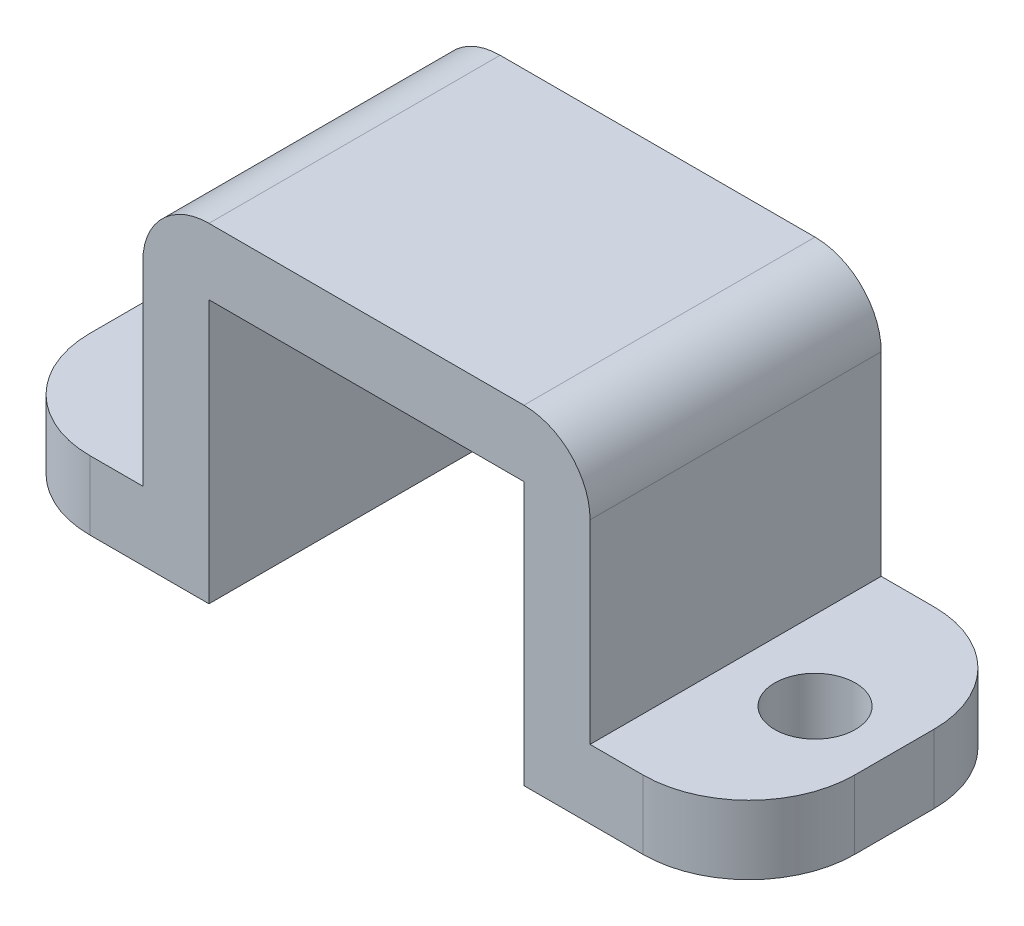
ISO-10303-21;
HEADER;
FILE_DESCRIPTION(('STEP AP214'),'2;1');
FILE_NAME('part.step','',(''),(''),'','','');
FILE_SCHEMA(('AUTOMOTIVE_DESIGN { 1 0 10303 214 1 1 1 1 }'));
ENDSEC;
DATA;
#1=APPLICATION_CONTEXT('core data for automotive mechanical design processes');
#2=APPLICATION_PROTOCOL_DEFINITION('international standard','automotive_design',2000,#1);
#3=PRODUCT_CONTEXT('',#1,'mechanical');
#4=PRODUCT('Part','Part','',(#3));
#5=PRODUCT_RELATED_PRODUCT_CATEGORY('part','',(#4));
#6=PRODUCT_DEFINITION_FORMATION('','',#4);
#7=PRODUCT_DEFINITION_CONTEXT('part definition',#1,'design');
#8=PRODUCT_DEFINITION('design','',#6,#7);
#9=PRODUCT_DEFINITION_SHAPE('','',#8);
#10=(LENGTH_UNIT() NAMED_UNIT(*) SI_UNIT(.MILLI.,.METRE.));
#11=(NAMED_UNIT(*) PLANE_ANGLE_UNIT() SI_UNIT($,.RADIAN.));
#12=(NAMED_UNIT(*) SI_UNIT($,.STERADIAN.) SOLID_ANGLE_UNIT());
#13=UNCERTAINTY_MEASURE_WITH_UNIT(LENGTH_MEASURE(1.E-05),#10,'distance_accuracy_value','');
#14=(GEOMETRIC_REPRESENTATION_CONTEXT(3) GLOBAL_UNCERTAINTY_ASSIGNED_CONTEXT((#13)) GLOBAL_UNIT_ASSIGNED_CONTEXT((#10,
#11,#12)) REPRESENTATION_CONTEXT('',''));
#15=CARTESIAN_POINT('',(0.,0.,0.));
#16=DIRECTION('',(0.,0.,1.));
#17=DIRECTION('',(1.,0.,0.));
#18=AXIS2_PLACEMENT_3D('',#15,#16,#17);
#19=CARTESIAN_POINT('',(-5.95,0.,11.));
#20=DIRECTION('',(-1.,0.,0.));
#21=DIRECTION('',(0.,0.,1.));
#22=AXIS2_PLACEMENT_3D('',#19,#20,#21);
#23=PLANE('',#22);
#24=DIRECTION('',(0.,1.,0.));
#25=VECTOR('',#24,1.);
#26=CARTESIAN_POINT('',(-5.95,0.,0.));
#27=LINE('',#26,#25);
#28=CARTESIAN_POINT('',(-5.95,0.,0.));
#29=VERTEX_POINT('',#28);
#30=CARTESIAN_POINT('',(-5.95,9.95,0.));
#31=VERTEX_POINT('',#30);
#32=EDGE_CURVE('E310',#29,#31,#27,.T.);
#33=ORIENTED_EDGE('',*,*,#32,.T.);
#34=DIRECTION('',(0.,0.,-1.));
#35=VECTOR('',#34,1.);
#36=CARTESIAN_POINT('',(-5.95,9.95,11.));
#37=LINE('',#36,#35);
#38=CARTESIAN_POINT('',(-5.95,9.95,11.));
#39=VERTEX_POINT('',#38);
#40=EDGE_CURVE('E182',#39,#31,#37,.T.);
#41=ORIENTED_EDGE('',*,*,#40,.F.);
#42=DIRECTION('',(0.,1.,0.));
#43=VECTOR('',#42,1.);
#44=CARTESIAN_POINT('',(-5.95,0.,11.));
#45=LINE('',#44,#43);
#46=CARTESIAN_POINT('',(-5.95,0.,11.));
#47=VERTEX_POINT('',#46);
#48=EDGE_CURVE('E169',#47,#39,#45,.T.);
#49=ORIENTED_EDGE('',*,*,#48,.F.);
#50=DIRECTION('',(0.,0.,-1.));
#51=VECTOR('',#50,1.);
#52=CARTESIAN_POINT('',(-5.95,0.,11.));
#53=LINE('',#52,#51);
#54=EDGE_CURVE('E180',#47,#29,#53,.T.);
#55=ORIENTED_EDGE('',*,*,#54,.T.);
#56=EDGE_LOOP('',(#33,#41,#49,#55));
#57=FACE_BOUND('',#56,.T.);
#58=ADVANCED_FACE('F38',(#57),#23,.F.);
#59=CARTESIAN_POINT('',(-5.95,9.95,11.));
#60=DIRECTION('',(0.,1.,0.));
#61=DIRECTION('',(0.,0.,1.));
#62=AXIS2_PLACEMENT_3D('',#59,#60,#61);
#63=PLANE('',#62);
#64=DIRECTION('',(1.,0.,0.));
#65=VECTOR('',#64,1.);
#66=CARTESIAN_POINT('',(-5.95,9.95,0.));
#67=LINE('',#66,#65);
#68=CARTESIAN_POINT('',(5.95,9.95,0.));
#69=VERTEX_POINT('',#68);
#70=EDGE_CURVE('E307',#31,#69,#67,.T.);
#71=ORIENTED_EDGE('',*,*,#70,.T.);
#72=DIRECTION('',(0.,0.,-1.));
#73=VECTOR('',#72,1.);
#74=CARTESIAN_POINT('',(5.95,9.95,11.));
#75=LINE('',#74,#73);
#76=CARTESIAN_POINT('',(5.95,9.95,11.));
#77=VERTEX_POINT('',#76);
#78=EDGE_CURVE('E194',#77,#69,#75,.T.);
#79=ORIENTED_EDGE('',*,*,#78,.F.);
#80=DIRECTION('',(1.,0.,0.));
#81=VECTOR('',#80,1.);
#82=CARTESIAN_POINT('',(-5.95,9.95,11.));
#83=LINE('',#82,#81);
#84=EDGE_CURVE('E184',#39,#77,#83,.T.);
#85=ORIENTED_EDGE('',*,*,#84,.F.);
#86=ORIENTED_EDGE('',*,*,#40,.T.);
#87=EDGE_LOOP('',(#71,#79,#85,#86));
#88=FACE_BOUND('',#87,.T.);
#89=ADVANCED_FACE('F350',(#88),#63,.F.);
#90=CARTESIAN_POINT('',(5.95,0.,11.));
#91=DIRECTION('',(1.,0.,0.));
#92=DIRECTION('',(0.,0.,-1.));
#93=AXIS2_PLACEMENT_3D('',#90,#91,#92);
#94=PLANE('',#93);
#95=DIRECTION('',(0.,-1.,0.));
#96=VECTOR('',#95,1.);
#97=CARTESIAN_POINT('',(5.95,0.,0.));
#98=LINE('',#97,#96);
#99=CARTESIAN_POINT('',(5.95,0.,0.));
#100=VERTEX_POINT('',#99);
#101=EDGE_CURVE('E303',#69,#100,#98,.T.);
#102=ORIENTED_EDGE('',*,*,#101,.T.);
#103=DIRECTION('',(0.,0.,-1.));
#104=VECTOR('',#103,1.);
#105=CARTESIAN_POINT('',(5.95,0.,11.));
#106=LINE('',#105,#104);
#107=CARTESIAN_POINT('',(5.95,0.,11.));
#108=VERTEX_POINT('',#107);
#109=EDGE_CURVE('E293',#108,#100,#106,.T.);
#110=ORIENTED_EDGE('',*,*,#109,.F.);
#111=DIRECTION('',(0.,-1.,0.));
#112=VECTOR('',#111,1.);
#113=CARTESIAN_POINT('',(5.95,0.,11.));
#114=LINE('',#113,#112);
#115=EDGE_CURVE('E304',#77,#108,#114,.T.);
#116=ORIENTED_EDGE('',*,*,#115,.F.);
#117=ORIENTED_EDGE('',*,*,#78,.T.);
#118=EDGE_LOOP('',(#102,#110,#116,#117));
#119=FACE_BOUND('',#118,.T.);
#120=ADVANCED_FACE('F301',(#119),#94,.F.);
#121=CARTESIAN_POINT('',(8.65875,0.,11.));
#122=DIRECTION('',(0.,1.,0.));
#123=DIRECTION('',(-1.,0.,0.));
#124=AXIS2_PLACEMENT_3D('',#121,#122,#123);
#125=PLANE('',#124);
#126=CARTESIAN_POINT('',(11.45,0.,5.5));
#127=DIRECTION('',(0.,1.,0.));
#128=DIRECTION('',(-1.,0.,0.));
#129=AXIS2_PLACEMENT_3D('',#126,#127,#128);
#130=CIRCLE('',#129,1.525);
#131=CARTESIAN_POINT('',(9.925,0.,5.5));
#132=VERTEX_POINT('',#131);
#133=EDGE_CURVE('E314',#132,#132,#130,.T.);
#134=ORIENTED_EDGE('',*,*,#133,.T.);
#135=EDGE_LOOP('',(#134));
#136=FACE_BOUND('',#135,.T.);
#137=DIRECTION('',(1.,0.,0.));
#138=VECTOR('',#137,1.);
#139=CARTESIAN_POINT('',(8.65875,0.,0.));
#140=LINE('',#139,#138);
#141=CARTESIAN_POINT('',(10.45,0.,0.));
#142=VERTEX_POINT('',#141);
#143=EDGE_CURVE('E268',#100,#142,#140,.T.);
#144=ORIENTED_EDGE('',*,*,#143,.T.);
#145=CARTESIAN_POINT('',(10.45,0.,4.));
#146=DIRECTION('',(0.,1.,0.));
#147=DIRECTION('',(-1.,0.,0.));
#148=AXIS2_PLACEMENT_3D('',#145,#146,#147);
#149=CIRCLE('',#148,4.);
#150=CARTESIAN_POINT('',(14.45,0.,4.));
#151=VERTEX_POINT('',#150);
#152=EDGE_CURVE('E210',#142,#151,#149,.F.);
#153=ORIENTED_EDGE('',*,*,#152,.T.);
#154=DIRECTION('',(0.,0.,-1.));
#155=VECTOR('',#154,1.);
#156=CARTESIAN_POINT('',(14.45,0.,11.));
#157=LINE('',#156,#155);
#158=CARTESIAN_POINT('',(14.45,0.,7.));
#159=VERTEX_POINT('',#158);
#160=EDGE_CURVE('E290',#159,#151,#157,.T.);
#161=ORIENTED_EDGE('',*,*,#160,.F.);
#162=CARTESIAN_POINT('',(10.45,0.,7.));
#163=DIRECTION('',(0.,1.,0.));
#164=DIRECTION('',(-1.,0.,0.));
#165=AXIS2_PLACEMENT_3D('',#162,#163,#164);
#166=CIRCLE('',#165,4.);
#167=CARTESIAN_POINT('',(10.45,0.,11.));
#168=VERTEX_POINT('',#167);
#169=EDGE_CURVE('E208',#159,#168,#166,.F.);
#170=ORIENTED_EDGE('',*,*,#169,.T.);
#171=DIRECTION('',(1.,0.,0.));
#172=VECTOR('',#171,1.);
#173=CARTESIAN_POINT('',(8.65875,0.,11.));
#174=LINE('',#173,#172);
#175=EDGE_CURVE('E320',#108,#168,#174,.T.);
#176=ORIENTED_EDGE('',*,*,#175,.F.);
#177=ORIENTED_EDGE('',*,*,#109,.T.);
#178=EDGE_LOOP('',(#144,#153,#161,#170,#176,#177));
#179=FACE_BOUND('',#178,.T.);
#180=ADVANCED_FACE('F390',(#136,#179),#125,.F.);
#181=CARTESIAN_POINT('',(14.45,0.,11.));
#182=DIRECTION('',(-1.,0.,0.));
#183=DIRECTION('',(0.,0.,1.));
#184=AXIS2_PLACEMENT_3D('',#181,#182,#183);
#185=PLANE('',#184);
#186=ORIENTED_EDGE('',*,*,#160,.T.);
#187=DIRECTION('',(0.,1.,0.));
#188=VECTOR('',#187,1.);
#189=CARTESIAN_POINT('',(14.45,0.,4.));
#190=LINE('',#189,#188);
#191=CARTESIAN_POINT('',(14.45,2.6,4.));
#192=VERTEX_POINT('',#191);
#193=EDGE_CURVE('E192',#151,#192,#190,.T.);
#194=ORIENTED_EDGE('',*,*,#193,.T.);
#195=DIRECTION('',(0.,0.,-1.));
#196=VECTOR('',#195,1.);
#197=CARTESIAN_POINT('',(14.45,2.6,11.));
#198=LINE('',#197,#196);
#199=CARTESIAN_POINT('',(14.45,2.6,7.));
#200=VERTEX_POINT('',#199);
#201=EDGE_CURVE('E287',#200,#192,#198,.T.);
#202=ORIENTED_EDGE('',*,*,#201,.F.);
#203=DIRECTION('',(0.,1.,0.));
#204=VECTOR('',#203,1.);
#205=CARTESIAN_POINT('',(14.45,0.,7.));
#206=LINE('',#205,#204);
#207=EDGE_CURVE('E190',#200,#159,#206,.F.);
#208=ORIENTED_EDGE('',*,*,#207,.T.);
#209=EDGE_LOOP('',(#186,#194,#202,#208));
#210=FACE_BOUND('',#209,.T.);
#211=ADVANCED_FACE('F395',(#210),#185,.F.);
#212=CARTESIAN_POINT('',(8.45,2.6,11.));
#213=DIRECTION('',(0.,-1.,0.));
#214=DIRECTION('',(1.,0.,0.));
#215=AXIS2_PLACEMENT_3D('',#212,#213,#214);
#216=PLANE('',#215);
#217=CARTESIAN_POINT('',(11.45,2.6,5.5));
#218=DIRECTION('',(0.,1.,0.));
#219=DIRECTION('',(-1.,0.,0.));
#220=AXIS2_PLACEMENT_3D('',#217,#218,#219);
#221=CIRCLE('',#220,1.525);
#222=CARTESIAN_POINT('',(9.925,2.6,5.5));
#223=VERTEX_POINT('',#222);
#224=EDGE_CURVE('E327',#223,#223,#221,.T.);
#225=ORIENTED_EDGE('',*,*,#224,.F.);
#226=EDGE_LOOP('',(#225));
#227=FACE_BOUND('',#226,.T.);
#228=ORIENTED_EDGE('',*,*,#201,.T.);
#229=CARTESIAN_POINT('',(10.45,2.6,4.));
#230=DIRECTION('',(0.,-1.,0.));
#231=DIRECTION('',(1.,0.,0.));
#232=AXIS2_PLACEMENT_3D('',#229,#230,#231);
#233=CIRCLE('',#232,4.);
#234=CARTESIAN_POINT('',(10.45,2.6,0.));
#235=VERTEX_POINT('',#234);
#236=EDGE_CURVE('E202',#192,#235,#233,.F.);
#237=ORIENTED_EDGE('',*,*,#236,.T.);
#238=DIRECTION('',(-1.,0.,0.));
#239=VECTOR('',#238,1.);
#240=CARTESIAN_POINT('',(8.45,2.6,0.));
#241=LINE('',#240,#239);
#242=CARTESIAN_POINT('',(8.45,2.6,0.));
#243=VERTEX_POINT('',#242);
#244=EDGE_CURVE('E264',#235,#243,#241,.T.);
#245=ORIENTED_EDGE('',*,*,#244,.T.);
#246=DIRECTION('',(0.,0.,-1.));
#247=VECTOR('',#246,1.);
#248=CARTESIAN_POINT('',(8.45,2.6,11.));
#249=LINE('',#248,#247);
#250=CARTESIAN_POINT('',(8.45,2.6,11.));
#251=VERTEX_POINT('',#250);
#252=EDGE_CURVE('E263',#251,#243,#249,.T.);
#253=ORIENTED_EDGE('',*,*,#252,.F.);
#254=DIRECTION('',(-1.,0.,0.));
#255=VECTOR('',#254,1.);
#256=CARTESIAN_POINT('',(8.45,2.6,11.));
#257=LINE('',#256,#255);
#258=CARTESIAN_POINT('',(10.45,2.6,11.));
#259=VERTEX_POINT('',#258);
#260=EDGE_CURVE('E318',#259,#251,#257,.T.);
#261=ORIENTED_EDGE('',*,*,#260,.F.);
#262=CARTESIAN_POINT('',(10.45,2.6,7.));
#263=DIRECTION('',(0.,-1.,0.));
#264=DIRECTION('',(1.,0.,0.));
#265=AXIS2_PLACEMENT_3D('',#262,#263,#264);
#266=CIRCLE('',#265,4.);
#267=EDGE_CURVE('E200',#259,#200,#266,.F.);
#268=ORIENTED_EDGE('',*,*,#267,.T.);
#269=EDGE_LOOP('',(#228,#237,#245,#253,#261,#268));
#270=FACE_BOUND('',#269,.T.);
#271=ADVANCED_FACE('F405',(#227,#270),#216,.F.);
#272=CARTESIAN_POINT('',(8.45,12.45,11.));
#273=DIRECTION('',(-1.,0.,0.));
#274=DIRECTION('',(0.,-1.,0.));
#275=AXIS2_PLACEMENT_3D('',#272,#273,#274);
#276=PLANE('',#275);
#277=DIRECTION('',(0.,1.,0.));
#278=VECTOR('',#277,1.);
#279=CARTESIAN_POINT('',(8.45,12.45,0.));
#280=LINE('',#279,#278);
#281=CARTESIAN_POINT('',(8.45,9.95,0.));
#282=VERTEX_POINT('',#281);
#283=EDGE_CURVE('E258',#243,#282,#280,.T.);
#284=ORIENTED_EDGE('',*,*,#283,.T.);
#285=DIRECTION('',(0.,0.,-1.));
#286=VECTOR('',#285,1.);
#287=CARTESIAN_POINT('',(8.45,9.95,11.));
#288=LINE('',#287,#286);
#289=CARTESIAN_POINT('',(8.45,9.95,11.));
#290=VERTEX_POINT('',#289);
#291=EDGE_CURVE('E62',#282,#290,#288,.F.);
#292=ORIENTED_EDGE('',*,*,#291,.T.);
#293=DIRECTION('',(0.,1.,0.));
#294=VECTOR('',#293,1.);
#295=CARTESIAN_POINT('',(8.45,12.45,11.));
#296=LINE('',#295,#294);
#297=EDGE_CURVE('E243',#251,#290,#296,.T.);
#298=ORIENTED_EDGE('',*,*,#297,.F.);
#299=ORIENTED_EDGE('',*,*,#252,.T.);
#300=EDGE_LOOP('',(#284,#292,#298,#299));
#301=FACE_BOUND('',#300,.T.);
#302=ADVANCED_FACE('F261',(#301),#276,.F.);
#303=CARTESIAN_POINT('',(8.45,12.45,11.));
#304=DIRECTION('',(0.,-1.,0.));
#305=DIRECTION('',(0.,0.,-1.));
#306=AXIS2_PLACEMENT_3D('',#303,#304,#305);
#307=PLANE('',#306);
#308=DIRECTION('',(-1.,0.,0.));
#309=VECTOR('',#308,1.);
#310=CARTESIAN_POINT('',(8.45,12.45,11.));
#311=LINE('',#310,#309);
#312=CARTESIAN_POINT('',(5.95,12.45,11.));
#313=VERTEX_POINT('',#312);
#314=CARTESIAN_POINT('',(-5.95,12.45,11.));
#315=VERTEX_POINT('',#314);
#316=EDGE_CURVE('E242',#313,#315,#311,.T.);
#317=ORIENTED_EDGE('',*,*,#316,.F.);
#318=DIRECTION('',(0.,0.,-1.));
#319=VECTOR('',#318,1.);
#320=CARTESIAN_POINT('',(5.95,12.45,11.));
#321=LINE('',#320,#319);
#322=CARTESIAN_POINT('',(5.95,12.45,0.));
#323=VERTEX_POINT('',#322);
#324=EDGE_CURVE('E231',#313,#323,#321,.T.);
#325=ORIENTED_EDGE('',*,*,#324,.T.);
#326=DIRECTION('',(-1.,0.,0.));
#327=VECTOR('',#326,1.);
#328=CARTESIAN_POINT('',(8.45,12.45,0.));
#329=LINE('',#328,#327);
#330=CARTESIAN_POINT('',(-5.95,12.45,0.));
#331=VERTEX_POINT('',#330);
#332=EDGE_CURVE('E259',#323,#331,#329,.T.);
#333=ORIENTED_EDGE('',*,*,#332,.T.);
#334=DIRECTION('',(0.,0.,-1.));
#335=VECTOR('',#334,1.);
#336=CARTESIAN_POINT('',(-5.95,12.45,11.));
#337=LINE('',#336,#335);
#338=EDGE_CURVE('E229',#331,#315,#337,.F.);
#339=ORIENTED_EDGE('',*,*,#338,.T.);
#340=EDGE_LOOP('',(#317,#325,#333,#339));
#341=FACE_BOUND('',#340,.T.);
#342=ADVANCED_FACE('F247',(#341),#307,.F.);
#343=CARTESIAN_POINT('',(-8.45,12.45,11.));
#344=DIRECTION('',(1.,0.,0.));
#345=DIRECTION('',(0.,1.,0.));
#346=AXIS2_PLACEMENT_3D('',#343,#344,#345);
#347=PLANE('',#346);
#348=DIRECTION('',(0.,-1.,0.));
#349=VECTOR('',#348,1.);
#350=CARTESIAN_POINT('',(-8.45,12.45,11.));
#351=LINE('',#350,#349);
#352=CARTESIAN_POINT('',(-8.45,9.95,11.));
#353=VERTEX_POINT('',#352);
#354=CARTESIAN_POINT('',(-8.45,2.6,11.));
#355=VERTEX_POINT('',#354);
#356=EDGE_CURVE('E251',#353,#355,#351,.T.);
#357=ORIENTED_EDGE('',*,*,#356,.F.);
#358=DIRECTION('',(0.,0.,-1.));
#359=VECTOR('',#358,1.);
#360=CARTESIAN_POINT('',(-8.45,9.95,11.));
#361=LINE('',#360,#359);
#362=CARTESIAN_POINT('',(-8.45,9.95,0.));
#363=VERTEX_POINT('',#362);
#364=EDGE_CURVE('E11',#353,#363,#361,.T.);
#365=ORIENTED_EDGE('',*,*,#364,.T.);
#366=DIRECTION('',(0.,-1.,0.));
#367=VECTOR('',#366,1.);
#368=CARTESIAN_POINT('',(-8.45,12.45,0.));
#369=LINE('',#368,#367);
#370=CARTESIAN_POINT('',(-8.45,2.6,0.));
#371=VERTEX_POINT('',#370);
#372=EDGE_CURVE('E266',#363,#371,#369,.T.);
#373=ORIENTED_EDGE('',*,*,#372,.T.);
#374=DIRECTION('',(0.,0.,-1.));
#375=VECTOR('',#374,1.);
#376=CARTESIAN_POINT('',(-8.45,2.6,11.));
#377=LINE('',#376,#375);
#378=EDGE_CURVE('E283',#355,#371,#377,.T.);
#379=ORIENTED_EDGE('',*,*,#378,.F.);
#380=EDGE_LOOP('',(#357,#365,#373,#379));
#381=FACE_BOUND('',#380,.T.);
#382=ADVANCED_FACE('F424',(#381),#347,.F.);
#383=CARTESIAN_POINT('',(-8.45,2.6,11.));
#384=DIRECTION('',(0.,-1.,0.));
#385=DIRECTION('',(1.,0.,0.));
#386=AXIS2_PLACEMENT_3D('',#383,#384,#385);
#387=PLANE('',#386);
#388=CARTESIAN_POINT('',(-11.45,2.6,5.5));
#389=DIRECTION('',(0.,1.,0.));
#390=DIRECTION('',(-1.,0.,0.));
#391=AXIS2_PLACEMENT_3D('',#388,#389,#390);
#392=CIRCLE('',#391,1.525);
#393=CARTESIAN_POINT('',(-12.975,2.6,5.5));
#394=VERTEX_POINT('',#393);
#395=EDGE_CURVE('E330',#394,#394,#392,.T.);
#396=ORIENTED_EDGE('',*,*,#395,.F.);
#397=EDGE_LOOP('',(#396));
#398=FACE_BOUND('',#397,.T.);
#399=DIRECTION('',(-1.,0.,0.));
#400=VECTOR('',#399,1.);
#401=CARTESIAN_POINT('',(-8.45,2.6,0.));
#402=LINE('',#401,#400);
#403=CARTESIAN_POINT('',(-10.45,2.6,0.));
#404=VERTEX_POINT('',#403);
#405=EDGE_CURVE('E273',#371,#404,#402,.T.);
#406=ORIENTED_EDGE('',*,*,#405,.T.);
#407=CARTESIAN_POINT('',(-10.45,2.6,4.));
#408=DIRECTION('',(0.,-1.,0.));
#409=DIRECTION('',(1.,0.,0.));
#410=AXIS2_PLACEMENT_3D('',#407,#408,#409);
#411=CIRCLE('',#410,4.);
#412=CARTESIAN_POINT('',(-14.45,2.6,4.));
#413=VERTEX_POINT('',#412);
#414=EDGE_CURVE('E227',#404,#413,#411,.F.);
#415=ORIENTED_EDGE('',*,*,#414,.T.);
#416=DIRECTION('',(0.,0.,-1.));
#417=VECTOR('',#416,1.);
#418=CARTESIAN_POINT('',(-14.45,2.6,11.));
#419=LINE('',#418,#417);
#420=CARTESIAN_POINT('',(-14.45,2.6,7.));
#421=VERTEX_POINT('',#420);
#422=EDGE_CURVE('E279',#421,#413,#419,.T.);
#423=ORIENTED_EDGE('',*,*,#422,.F.);
#424=CARTESIAN_POINT('',(-10.45,2.6,7.));
#425=DIRECTION('',(0.,-1.,0.));
#426=DIRECTION('',(1.,0.,0.));
#427=AXIS2_PLACEMENT_3D('',#424,#425,#426);
#428=CIRCLE('',#427,4.);
#429=CARTESIAN_POINT('',(-10.45,2.6,11.));
#430=VERTEX_POINT('',#429);
#431=EDGE_CURVE('E225',#421,#430,#428,.F.);
#432=ORIENTED_EDGE('',*,*,#431,.T.);
#433=DIRECTION('',(-1.,0.,0.));
#434=VECTOR('',#433,1.);
#435=CARTESIAN_POINT('',(-8.45,2.6,11.));
#436=LINE('',#435,#434);
#437=EDGE_CURVE('E280',#355,#430,#436,.T.);
#438=ORIENTED_EDGE('',*,*,#437,.F.);
#439=ORIENTED_EDGE('',*,*,#378,.T.);
#440=EDGE_LOOP('',(#406,#415,#423,#432,#438,#439));
#441=FACE_BOUND('',#440,.T.);
#442=ADVANCED_FACE('F418',(#398,#441),#387,.F.);
#443=CARTESIAN_POINT('',(-14.45,0.,11.));
#444=DIRECTION('',(1.,0.,0.));
#445=DIRECTION('',(0.,0.,-1.));
#446=AXIS2_PLACEMENT_3D('',#443,#444,#445);
#447=PLANE('',#446);
#448=ORIENTED_EDGE('',*,*,#422,.T.);
#449=DIRECTION('',(0.,-1.,0.));
#450=VECTOR('',#449,1.);
#451=CARTESIAN_POINT('',(-14.45,0.,4.));
#452=LINE('',#451,#450);
#453=CARTESIAN_POINT('',(-14.45,0.,4.));
#454=VERTEX_POINT('',#453);
#455=EDGE_CURVE('E218',#413,#454,#452,.T.);
#456=ORIENTED_EDGE('',*,*,#455,.T.);
#457=DIRECTION('',(0.,0.,-1.));
#458=VECTOR('',#457,1.);
#459=CARTESIAN_POINT('',(-14.45,0.,11.));
#460=LINE('',#459,#458);
#461=CARTESIAN_POINT('',(-14.45,0.,7.));
#462=VERTEX_POINT('',#461);
#463=EDGE_CURVE('E277',#462,#454,#460,.T.);
#464=ORIENTED_EDGE('',*,*,#463,.F.);
#465=DIRECTION('',(0.,-1.,0.));
#466=VECTOR('',#465,1.);
#467=CARTESIAN_POINT('',(-14.45,2.6,7.));
#468=LINE('',#467,#466);
#469=EDGE_CURVE('E216',#462,#421,#468,.F.);
#470=ORIENTED_EDGE('',*,*,#469,.T.);
#471=EDGE_LOOP('',(#448,#456,#464,#470));
#472=FACE_BOUND('',#471,.T.);
#473=ADVANCED_FACE('F423',(#472),#447,.F.);
#474=CARTESIAN_POINT('',(-8.65875,0.,11.));
#475=DIRECTION('',(0.,1.,0.));
#476=DIRECTION('',(-1.,0.,0.));
#477=AXIS2_PLACEMENT_3D('',#474,#475,#476);
#478=PLANE('',#477);
#479=CARTESIAN_POINT('',(-11.45,0.,5.5));
#480=DIRECTION('',(0.,1.,0.));
#481=DIRECTION('',(-1.,0.,0.));
#482=AXIS2_PLACEMENT_3D('',#479,#480,#481);
#483=CIRCLE('',#482,1.525);
#484=CARTESIAN_POINT('',(-12.975,0.,5.5));
#485=VERTEX_POINT('',#484);
#486=EDGE_CURVE('E42',#485,#485,#483,.T.);
#487=ORIENTED_EDGE('',*,*,#486,.T.);
#488=EDGE_LOOP('',(#487));
#489=FACE_BOUND('',#488,.T.);
#490=ORIENTED_EDGE('',*,*,#463,.T.);
#491=CARTESIAN_POINT('',(-10.45,0.,4.));
#492=DIRECTION('',(0.,1.,0.));
#493=DIRECTION('',(-1.,0.,0.));
#494=AXIS2_PLACEMENT_3D('',#491,#492,#493);
#495=CIRCLE('',#494,4.);
#496=CARTESIAN_POINT('',(-10.45,0.,0.));
#497=VERTEX_POINT('',#496);
#498=EDGE_CURVE('E223',#454,#497,#495,.F.);
#499=ORIENTED_EDGE('',*,*,#498,.T.);
#500=DIRECTION('',(1.,0.,0.));
#501=VECTOR('',#500,1.);
#502=CARTESIAN_POINT('',(-8.65875,0.,0.));
#503=LINE('',#502,#501);
#504=EDGE_CURVE('E176',#497,#29,#503,.T.);
#505=ORIENTED_EDGE('',*,*,#504,.T.);
#506=ORIENTED_EDGE('',*,*,#54,.F.);
#507=DIRECTION('',(1.,0.,0.));
#508=VECTOR('',#507,1.);
#509=CARTESIAN_POINT('',(-8.65875,0.,11.));
#510=LINE('',#509,#508);
#511=CARTESIAN_POINT('',(-10.45,0.,11.));
#512=VERTEX_POINT('',#511);
#513=EDGE_CURVE('E166',#512,#47,#510,.T.);
#514=ORIENTED_EDGE('',*,*,#513,.F.);
#515=CARTESIAN_POINT('',(-10.45,0.,7.));
#516=DIRECTION('',(0.,1.,0.));
#517=DIRECTION('',(-1.,0.,0.));
#518=AXIS2_PLACEMENT_3D('',#515,#516,#517);
#519=CIRCLE('',#518,4.);
#520=EDGE_CURVE('E221',#512,#462,#519,.F.);
#521=ORIENTED_EDGE('',*,*,#520,.T.);
#522=EDGE_LOOP('',(#490,#499,#505,#506,#514,#521));
#523=FACE_BOUND('',#522,.T.);
#524=ADVANCED_FACE('F187',(#489,#523),#478,.F.);
#525=CARTESIAN_POINT('',(0.,0.,11.));
#526=DIRECTION('',(0.,0.,1.));
#527=DIRECTION('',(1.,0.,0.));
#528=AXIS2_PLACEMENT_3D('',#525,#526,#527);
#529=PLANE('',#528);
#530=ORIENTED_EDGE('',*,*,#297,.T.);
#531=CARTESIAN_POINT('',(5.95,9.95,11.));
#532=DIRECTION('',(0.,0.,1.));
#533=DIRECTION('',(1.,0.,0.));
#534=AXIS2_PLACEMENT_3D('',#531,#532,#533);
#535=CIRCLE('',#534,2.5);
#536=EDGE_CURVE('E47',#290,#313,#535,.T.);
#537=ORIENTED_EDGE('',*,*,#536,.T.);
#538=ORIENTED_EDGE('',*,*,#316,.T.);
#539=CARTESIAN_POINT('',(-5.95,9.95,11.));
#540=DIRECTION('',(0.,0.,1.));
#541=DIRECTION('',(1.,0.,0.));
#542=AXIS2_PLACEMENT_3D('',#539,#540,#541);
#543=CIRCLE('',#542,2.5);
#544=EDGE_CURVE('E54',#315,#353,#543,.T.);
#545=ORIENTED_EDGE('',*,*,#544,.T.);
#546=ORIENTED_EDGE('',*,*,#356,.T.);
#547=ORIENTED_EDGE('',*,*,#437,.T.);
#548=DIRECTION('',(0.,-1.,0.));
#549=VECTOR('',#548,1.);
#550=CARTESIAN_POINT('',(-10.45,0.,11.));
#551=LINE('',#550,#549);
#552=EDGE_CURVE('E173',#430,#512,#551,.T.);
#553=ORIENTED_EDGE('',*,*,#552,.T.);
#554=ORIENTED_EDGE('',*,*,#513,.T.);
#555=ORIENTED_EDGE('',*,*,#48,.T.);
#556=ORIENTED_EDGE('',*,*,#84,.T.);
#557=ORIENTED_EDGE('',*,*,#115,.T.);
#558=ORIENTED_EDGE('',*,*,#175,.T.);
#559=DIRECTION('',(0.,1.,0.));
#560=VECTOR('',#559,1.);
#561=CARTESIAN_POINT('',(10.45,2.6,11.));
#562=LINE('',#561,#560);
#563=EDGE_CURVE('E213',#168,#259,#562,.T.);
#564=ORIENTED_EDGE('',*,*,#563,.T.);
#565=ORIENTED_EDGE('',*,*,#260,.T.);
#566=EDGE_LOOP('',(#530,#537,#538,#545,#546,#547,#553,#554,#555,#556,#557,#558,#564,#565));
#567=FACE_BOUND('',#566,.T.);
#568=ADVANCED_FACE('F168',(#567),#529,.T.);
#569=CARTESIAN_POINT('',(0.,0.,0.));
#570=DIRECTION('',(0.,0.,1.));
#571=DIRECTION('',(1.,0.,0.));
#572=AXIS2_PLACEMENT_3D('',#569,#570,#571);
#573=PLANE('',#572);
#574=ORIENTED_EDGE('',*,*,#332,.F.);
#575=CARTESIAN_POINT('',(5.95,9.95,0.));
#576=DIRECTION('',(0.,0.,1.));
#577=DIRECTION('',(1.,0.,0.));
#578=AXIS2_PLACEMENT_3D('',#575,#576,#577);
#579=CIRCLE('',#578,2.5);
#580=EDGE_CURVE('E236',#323,#282,#579,.F.);
#581=ORIENTED_EDGE('',*,*,#580,.T.);
#582=ORIENTED_EDGE('',*,*,#283,.F.);
#583=ORIENTED_EDGE('',*,*,#244,.F.);
#584=DIRECTION('',(0.,1.,0.));
#585=VECTOR('',#584,1.);
#586=CARTESIAN_POINT('',(10.45,0.,0.));
#587=LINE('',#586,#585);
#588=EDGE_CURVE('E206',#235,#142,#587,.F.);
#589=ORIENTED_EDGE('',*,*,#588,.T.);
#590=ORIENTED_EDGE('',*,*,#143,.F.);
#591=ORIENTED_EDGE('',*,*,#101,.F.);
#592=ORIENTED_EDGE('',*,*,#70,.F.);
#593=ORIENTED_EDGE('',*,*,#32,.F.);
#594=ORIENTED_EDGE('',*,*,#504,.F.);
#595=DIRECTION('',(0.,-1.,0.));
#596=VECTOR('',#595,1.);
#597=CARTESIAN_POINT('',(-10.45,0.,0.));
#598=LINE('',#597,#596);
#599=EDGE_CURVE('E204',#497,#404,#598,.F.);
#600=ORIENTED_EDGE('',*,*,#599,.T.);
#601=ORIENTED_EDGE('',*,*,#405,.F.);
#602=ORIENTED_EDGE('',*,*,#372,.F.);
#603=CARTESIAN_POINT('',(-5.95,9.95,0.));
#604=DIRECTION('',(0.,0.,1.));
#605=DIRECTION('',(1.,0.,0.));
#606=AXIS2_PLACEMENT_3D('',#603,#604,#605);
#607=CIRCLE('',#606,2.5);
#608=EDGE_CURVE('E234',#363,#331,#607,.F.);
#609=ORIENTED_EDGE('',*,*,#608,.T.);
#610=EDGE_LOOP('',(#574,#581,#582,#583,#589,#590,#591,#592,#593,#594,#600,#601,#602,#609));
#611=FACE_BOUND('',#610,.T.);
#612=ADVANCED_FACE('F256',(#611),#573,.F.);
#613=CARTESIAN_POINT('',(10.45,0.,4.));
#614=DIRECTION('',(0.,1.,0.));
#615=DIRECTION('',(0.,0.,1.));
#616=AXIS2_PLACEMENT_3D('',#613,#614,#615);
#617=CYLINDRICAL_SURFACE('',#616,4.);
#618=ORIENTED_EDGE('',*,*,#152,.F.);
#619=ORIENTED_EDGE('',*,*,#588,.F.);
#620=ORIENTED_EDGE('',*,*,#236,.F.);
#621=ORIENTED_EDGE('',*,*,#193,.F.);
#622=EDGE_LOOP('',(#618,#619,#620,#621));
#623=FACE_BOUND('',#622,.T.);
#624=ADVANCED_FACE('F358',(#623),#617,.T.);
#625=CARTESIAN_POINT('',(10.45,0.,7.));
#626=DIRECTION('',(0.,-1.,0.));
#627=DIRECTION('',(0.,0.,-1.));
#628=AXIS2_PLACEMENT_3D('',#625,#626,#627);
#629=CYLINDRICAL_SURFACE('',#628,4.);
#630=ORIENTED_EDGE('',*,*,#169,.F.);
#631=ORIENTED_EDGE('',*,*,#207,.F.);
#632=ORIENTED_EDGE('',*,*,#267,.F.);
#633=ORIENTED_EDGE('',*,*,#563,.F.);
#634=EDGE_LOOP('',(#630,#631,#632,#633));
#635=FACE_BOUND('',#634,.T.);
#636=ADVANCED_FACE('F361',(#635),#629,.T.);
#637=CARTESIAN_POINT('',(-10.45,0.,4.));
#638=DIRECTION('',(0.,-1.,0.));
#639=DIRECTION('',(0.,0.,-1.));
#640=AXIS2_PLACEMENT_3D('',#637,#638,#639);
#641=CYLINDRICAL_SURFACE('',#640,4.);
#642=ORIENTED_EDGE('',*,*,#414,.F.);
#643=ORIENTED_EDGE('',*,*,#599,.F.);
#644=ORIENTED_EDGE('',*,*,#498,.F.);
#645=ORIENTED_EDGE('',*,*,#455,.F.);
#646=EDGE_LOOP('',(#642,#643,#644,#645));
#647=FACE_BOUND('',#646,.T.);
#648=ADVANCED_FACE('F365',(#647),#641,.T.);
#649=CARTESIAN_POINT('',(-10.45,0.,7.));
#650=DIRECTION('',(0.,1.,0.));
#651=DIRECTION('',(0.,0.,1.));
#652=AXIS2_PLACEMENT_3D('',#649,#650,#651);
#653=CYLINDRICAL_SURFACE('',#652,4.);
#654=ORIENTED_EDGE('',*,*,#431,.F.);
#655=ORIENTED_EDGE('',*,*,#469,.F.);
#656=ORIENTED_EDGE('',*,*,#520,.F.);
#657=ORIENTED_EDGE('',*,*,#552,.F.);
#658=EDGE_LOOP('',(#654,#655,#656,#657));
#659=FACE_BOUND('',#658,.T.);
#660=ADVANCED_FACE('F369',(#659),#653,.T.);
#661=CARTESIAN_POINT('',(5.95,9.95,11.));
#662=DIRECTION('',(0.,0.,-1.));
#663=DIRECTION('',(-1.,0.,0.));
#664=AXIS2_PLACEMENT_3D('',#661,#662,#663);
#665=CYLINDRICAL_SURFACE('',#664,2.5);
#666=ORIENTED_EDGE('',*,*,#536,.F.);
#667=ORIENTED_EDGE('',*,*,#291,.F.);
#668=ORIENTED_EDGE('',*,*,#580,.F.);
#669=ORIENTED_EDGE('',*,*,#324,.F.);
#670=EDGE_LOOP('',(#666,#667,#668,#669));
#671=FACE_BOUND('',#670,.T.);
#672=ADVANCED_FACE('F253',(#671),#665,.T.);
#673=CARTESIAN_POINT('',(-5.95,9.95,11.));
#674=DIRECTION('',(0.,0.,-1.));
#675=DIRECTION('',(-1.,0.,0.));
#676=AXIS2_PLACEMENT_3D('',#673,#674,#675);
#677=CYLINDRICAL_SURFACE('',#676,2.5);
#678=ORIENTED_EDGE('',*,*,#544,.F.);
#679=ORIENTED_EDGE('',*,*,#338,.F.);
#680=ORIENTED_EDGE('',*,*,#608,.F.);
#681=ORIENTED_EDGE('',*,*,#364,.F.);
#682=EDGE_LOOP('',(#678,#679,#680,#681));
#683=FACE_BOUND('',#682,.T.);
#684=ADVANCED_FACE('F40',(#683),#677,.T.);
#685=CARTESIAN_POINT('',(-11.45,-8.4,5.5));
#686=DIRECTION('',(0.,1.,0.));
#687=DIRECTION('',(-1.,0.,0.));
#688=AXIS2_PLACEMENT_3D('',#685,#686,#687);
#689=CYLINDRICAL_SURFACE('',#688,1.525);
#690=ORIENTED_EDGE('',*,*,#395,.T.);
#691=EDGE_LOOP('',(#690));
#692=FACE_BOUND('',#691,.T.);
#693=ORIENTED_EDGE('',*,*,#486,.F.);
#694=EDGE_LOOP('',(#693));
#695=FACE_BOUND('',#694,.T.);
#696=ADVANCED_FACE('F338',(#692,#695),#689,.F.);
#697=CARTESIAN_POINT('',(11.45,-8.4,5.5));
#698=DIRECTION('',(0.,1.,0.));
#699=DIRECTION('',(-1.,0.,0.));
#700=AXIS2_PLACEMENT_3D('',#697,#698,#699);
#701=CYLINDRICAL_SURFACE('',#700,1.525);
#702=ORIENTED_EDGE('',*,*,#224,.T.);
#703=EDGE_LOOP('',(#702));
#704=FACE_BOUND('',#703,.T.);
#705=ORIENTED_EDGE('',*,*,#133,.F.);
#706=EDGE_LOOP('',(#705));
#707=FACE_BOUND('',#706,.T.);
#708=ADVANCED_FACE('F340',(#704,#707),#701,.F.);
#709=CLOSED_SHELL('',(#58,#89,#120,#180,#211,#271,#302,#342,#382,#442,#473,#524,#568,#612,#624,
#636,#648,#660,#672,#684,#696,#708));
#710=MANIFOLD_SOLID_BREP('B2',#709);
#711=ADVANCED_BREP_SHAPE_REPRESENTATION('',(#18,#710),#14);
#712=SHAPE_DEFINITION_REPRESENTATION(#9,#711);
ENDSEC;
END-ISO-10303-21;
